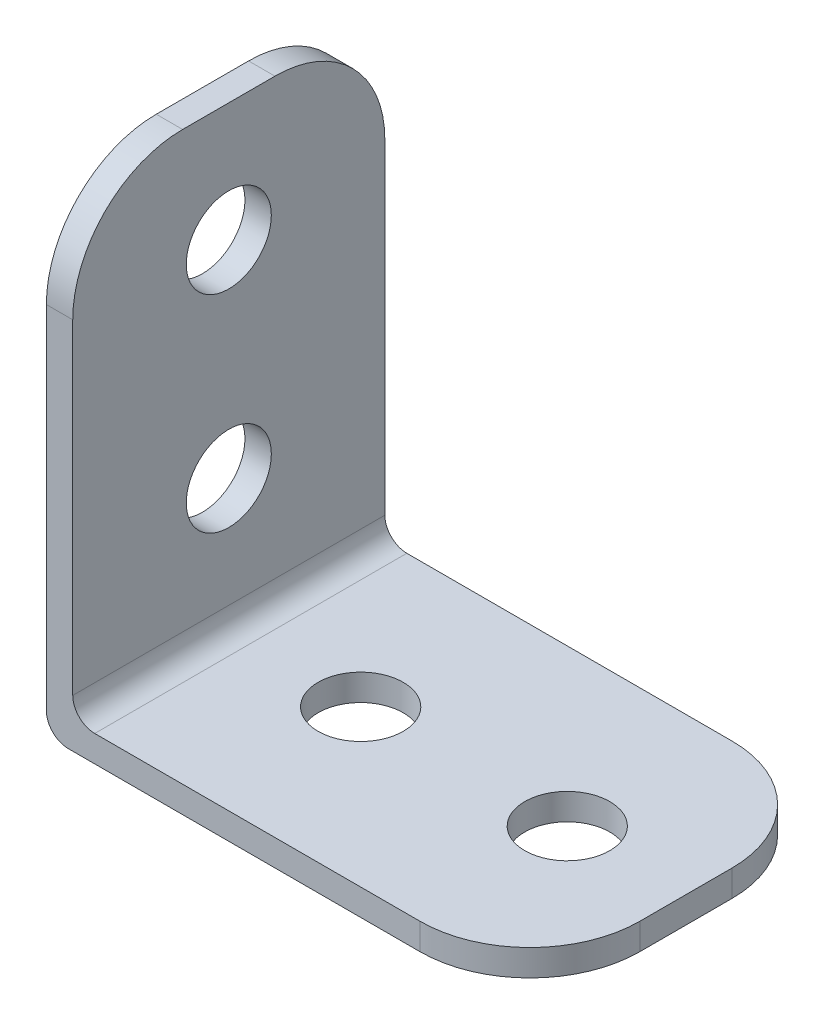
ISO-10303-21;
HEADER;
FILE_DESCRIPTION(('STEP AP214'),'2;1');
FILE_NAME('part.step','',(''),(''),'','','');
FILE_SCHEMA(('AUTOMOTIVE_DESIGN { 1 0 10303 214 1 1 1 1 }'));
ENDSEC;
DATA;
#1=APPLICATION_CONTEXT('core data for automotive mechanical design processes');
#2=APPLICATION_PROTOCOL_DEFINITION('international standard','automotive_design',2000,#1);
#3=PRODUCT_CONTEXT('',#1,'mechanical');
#4=PRODUCT('Part','Part','',(#3));
#5=PRODUCT_RELATED_PRODUCT_CATEGORY('part','',(#4));
#6=PRODUCT_DEFINITION_FORMATION('','',#4);
#7=PRODUCT_DEFINITION_CONTEXT('part definition',#1,'design');
#8=PRODUCT_DEFINITION('design','',#6,#7);
#9=PRODUCT_DEFINITION_SHAPE('','',#8);
#10=(LENGTH_UNIT() NAMED_UNIT(*) SI_UNIT(.MILLI.,.METRE.));
#11=(NAMED_UNIT(*) PLANE_ANGLE_UNIT() SI_UNIT($,.RADIAN.));
#12=(NAMED_UNIT(*) SI_UNIT($,.STERADIAN.) SOLID_ANGLE_UNIT());
#13=UNCERTAINTY_MEASURE_WITH_UNIT(LENGTH_MEASURE(1.E-05),#10,'distance_accuracy_value','');
#14=(GEOMETRIC_REPRESENTATION_CONTEXT(3) GLOBAL_UNCERTAINTY_ASSIGNED_CONTEXT((#13)) GLOBAL_UNIT_ASSIGNED_CONTEXT((#10,
#11,#12)) REPRESENTATION_CONTEXT('',''));
#15=CARTESIAN_POINT('',(0.,0.,0.));
#16=DIRECTION('',(0.,0.,1.));
#17=DIRECTION('',(1.,0.,0.));
#18=AXIS2_PLACEMENT_3D('',#15,#16,#17);
#19=CARTESIAN_POINT('',(14.943252817659,1.524,0.));
#20=DIRECTION('',(1.,0.,0.));
#21=DIRECTION('',(0.,0.,-1.));
#22=AXIS2_PLACEMENT_3D('',#19,#20,#21);
#23=PLANE('',#22);
#24=DIRECTION('',(0.,0.,1.));
#25=VECTOR('',#24,1.);
#26=CARTESIAN_POINT('',(14.943252817659,0.,0.));
#27=LINE('',#26,#25);
#28=CARTESIAN_POINT('',(14.943252817659,0.,-2.77220800376886));
#29=VERTEX_POINT('',#28);
#30=CARTESIAN_POINT('',(14.943252817659,0.,2.56179199623114));
#31=VERTEX_POINT('',#30);
#32=EDGE_CURVE('E270',#29,#31,#27,.T.);
#33=ORIENTED_EDGE('',*,*,#32,.F.);
#34=DIRECTION('',(0.,-1.,0.));
#35=VECTOR('',#34,1.);
#36=CARTESIAN_POINT('',(14.943252817659,1.524,-2.77220800376886));
#37=LINE('',#36,#35);
#38=CARTESIAN_POINT('',(14.943252817659,1.524,-2.77220800376886));
#39=VERTEX_POINT('',#38);
#40=EDGE_CURVE('E67',#29,#39,#37,.F.);
#41=ORIENTED_EDGE('',*,*,#40,.T.);
#42=DIRECTION('',(0.,0.,1.));
#43=VECTOR('',#42,1.);
#44=CARTESIAN_POINT('',(14.943252817659,1.524,0.));
#45=LINE('',#44,#43);
#46=CARTESIAN_POINT('',(14.943252817659,1.524,2.56179199623114));
#47=VERTEX_POINT('',#46);
#48=EDGE_CURVE('E160',#39,#47,#45,.T.);
#49=ORIENTED_EDGE('',*,*,#48,.T.);
#50=DIRECTION('',(0.,-1.,0.));
#51=VECTOR('',#50,1.);
#52=CARTESIAN_POINT('',(14.943252817659,0.,2.56179199623114));
#53=LINE('',#52,#51);
#54=EDGE_CURVE('E227',#47,#31,#53,.T.);
#55=ORIENTED_EDGE('',*,*,#54,.T.);
#56=EDGE_LOOP('',(#33,#41,#49,#55));
#57=FACE_BOUND('',#56,.T.);
#58=ADVANCED_FACE('F43',(#57),#23,.T.);
#59=CARTESIAN_POINT('',(0.,1.524,-9.12220800376886));
#60=DIRECTION('',(0.,0.,-1.));
#61=DIRECTION('',(-1.,0.,0.));
#62=AXIS2_PLACEMENT_3D('',#59,#60,#61);
#63=PLANE('',#62);
#64=DIRECTION('',(0.,-1.,0.));
#65=VECTOR('',#64,1.);
#66=CARTESIAN_POINT('',(-12.996747182341,27.94,-9.12220800376886));
#67=LINE('',#66,#65);
#68=CARTESIAN_POINT('',(-12.996747182341,21.59,-9.12220800376886));
#69=VERTEX_POINT('',#68);
#70=CARTESIAN_POINT('',(-12.996747182341,1.27,-9.12220800376886));
#71=VERTEX_POINT('',#70);
#72=EDGE_CURVE('E259',#69,#71,#67,.T.);
#73=ORIENTED_EDGE('',*,*,#72,.F.);
#74=DIRECTION('',(1.,0.,0.));
#75=VECTOR('',#74,1.);
#76=CARTESIAN_POINT('',(0.,21.59,-9.12220800376886));
#77=LINE('',#76,#75);
#78=CARTESIAN_POINT('',(-11.4727471823411,21.59,-9.12220800376886));
#79=VERTEX_POINT('',#78);
#80=EDGE_CURVE('E218',#69,#79,#77,.T.);
#81=ORIENTED_EDGE('',*,*,#80,.T.);
#82=DIRECTION('',(0.,-1.,0.));
#83=VECTOR('',#82,1.);
#84=CARTESIAN_POINT('',(-11.4727471823411,27.94,-9.12220800376886));
#85=LINE('',#84,#83);
#86=CARTESIAN_POINT('',(-11.4727471823411,2.794,-9.12220800376886));
#87=VERTEX_POINT('',#86);
#88=EDGE_CURVE('E144',#79,#87,#85,.T.);
#89=ORIENTED_EDGE('',*,*,#88,.T.);
#90=CARTESIAN_POINT('',(-10.202747182341,2.794,-9.12220800376886));
#91=DIRECTION('',(0.,0.,-1.));
#92=DIRECTION('',(-1.,0.,0.));
#93=AXIS2_PLACEMENT_3D('',#90,#91,#92);
#94=CIRCLE('',#93,1.27);
#95=CARTESIAN_POINT('',(-10.202747182341,1.524,-9.12220800376886));
#96=VERTEX_POINT('',#95);
#97=EDGE_CURVE('E135',#87,#96,#94,.F.);
#98=ORIENTED_EDGE('',*,*,#97,.T.);
#99=DIRECTION('',(1.,0.,0.));
#100=VECTOR('',#99,1.);
#101=CARTESIAN_POINT('',(0.,1.524,-9.12220800376886));
#102=LINE('',#101,#100);
#103=CARTESIAN_POINT('',(8.59325281765895,1.524,-9.12220800376886));
#104=VERTEX_POINT('',#103);
#105=EDGE_CURVE('E140',#96,#104,#102,.T.);
#106=ORIENTED_EDGE('',*,*,#105,.T.);
#107=DIRECTION('',(0.,-1.,0.));
#108=VECTOR('',#107,1.);
#109=CARTESIAN_POINT('',(8.59325281765895,1.524,-9.12220800376886));
#110=LINE('',#109,#108);
#111=CARTESIAN_POINT('',(8.59325281765895,0.,-9.12220800376886));
#112=VERTEX_POINT('',#111);
#113=EDGE_CURVE('E215',#104,#112,#110,.T.);
#114=ORIENTED_EDGE('',*,*,#113,.T.);
#115=DIRECTION('',(1.,0.,0.));
#116=VECTOR('',#115,1.);
#117=CARTESIAN_POINT('',(0.,0.,-9.12220800376886));
#118=LINE('',#117,#116);
#119=CARTESIAN_POINT('',(-11.7267471823411,0.,-9.12220800376886));
#120=VERTEX_POINT('',#119);
#121=EDGE_CURVE('E275',#120,#112,#118,.T.);
#122=ORIENTED_EDGE('',*,*,#121,.F.);
#123=CARTESIAN_POINT('',(-11.7267471823411,1.27,-9.12220800376886));
#124=DIRECTION('',(0.,0.,-1.));
#125=DIRECTION('',(-1.,0.,0.));
#126=AXIS2_PLACEMENT_3D('',#123,#124,#125);
#127=CIRCLE('',#126,1.27);
#128=EDGE_CURVE('E185',#120,#71,#127,.T.);
#129=ORIENTED_EDGE('',*,*,#128,.T.);
#130=EDGE_LOOP('',(#73,#81,#89,#98,#106,#114,#122,#129));
#131=FACE_BOUND('',#130,.T.);
#132=ADVANCED_FACE('F138',(#131),#63,.T.);
#133=CARTESIAN_POINT('',(0.,1.524,8.91179199623114));
#134=DIRECTION('',(0.,0.,-1.));
#135=DIRECTION('',(-1.,0.,0.));
#136=AXIS2_PLACEMENT_3D('',#133,#134,#135);
#137=PLANE('',#136);
#138=DIRECTION('',(0.,-1.,0.));
#139=VECTOR('',#138,1.);
#140=CARTESIAN_POINT('',(-11.472747182341,27.94,8.91179199623114));
#141=LINE('',#140,#139);
#142=CARTESIAN_POINT('',(-11.472747182341,21.59,8.91179199623114));
#143=VERTEX_POINT('',#142);
#144=CARTESIAN_POINT('',(-11.472747182341,2.794,8.91179199623114));
#145=VERTEX_POINT('',#144);
#146=EDGE_CURVE('E264',#143,#145,#141,.T.);
#147=ORIENTED_EDGE('',*,*,#146,.F.);
#148=DIRECTION('',(1.,0.,0.));
#149=VECTOR('',#148,1.);
#150=CARTESIAN_POINT('',(-12.996747182341,21.59,8.91179199623114));
#151=LINE('',#150,#149);
#152=CARTESIAN_POINT('',(-12.996747182341,21.59,8.91179199623114));
#153=VERTEX_POINT('',#152);
#154=EDGE_CURVE('E206',#143,#153,#151,.F.);
#155=ORIENTED_EDGE('',*,*,#154,.T.);
#156=DIRECTION('',(0.,-1.,0.));
#157=VECTOR('',#156,1.);
#158=CARTESIAN_POINT('',(-12.996747182341,27.94,8.91179199623114));
#159=LINE('',#158,#157);
#160=CARTESIAN_POINT('',(-12.996747182341,1.27,8.91179199623114));
#161=VERTEX_POINT('',#160);
#162=EDGE_CURVE('E267',#153,#161,#159,.T.);
#163=ORIENTED_EDGE('',*,*,#162,.T.);
#164=CARTESIAN_POINT('',(-11.7267471823411,1.27,8.91179199623114));
#165=DIRECTION('',(0.,0.,-1.));
#166=DIRECTION('',(-1.,0.,0.));
#167=AXIS2_PLACEMENT_3D('',#164,#165,#166);
#168=CIRCLE('',#167,1.27);
#169=CARTESIAN_POINT('',(-11.7267471823411,0.,8.91179199623114));
#170=VERTEX_POINT('',#169);
#171=EDGE_CURVE('E179',#161,#170,#168,.F.);
#172=ORIENTED_EDGE('',*,*,#171,.T.);
#173=DIRECTION('',(1.,0.,0.));
#174=VECTOR('',#173,1.);
#175=CARTESIAN_POINT('',(0.,0.,8.91179199623114));
#176=LINE('',#175,#174);
#177=CARTESIAN_POINT('',(8.59325281765895,0.,8.91179199623114));
#178=VERTEX_POINT('',#177);
#179=EDGE_CURVE('E173',#170,#178,#176,.T.);
#180=ORIENTED_EDGE('',*,*,#179,.T.);
#181=DIRECTION('',(0.,-1.,0.));
#182=VECTOR('',#181,1.);
#183=CARTESIAN_POINT('',(8.59325281765895,1.524,8.91179199623114));
#184=LINE('',#183,#182);
#185=CARTESIAN_POINT('',(8.59325281765895,1.524,8.91179199623114));
#186=VERTEX_POINT('',#185);
#187=EDGE_CURVE('E203',#178,#186,#184,.F.);
#188=ORIENTED_EDGE('',*,*,#187,.T.);
#189=DIRECTION('',(1.,0.,0.));
#190=VECTOR('',#189,1.);
#191=CARTESIAN_POINT('',(0.,1.524,8.91179199623114));
#192=LINE('',#191,#190);
#193=CARTESIAN_POINT('',(-10.202747182341,1.524,8.91179199623114));
#194=VERTEX_POINT('',#193);
#195=EDGE_CURVE('E159',#194,#186,#192,.T.);
#196=ORIENTED_EDGE('',*,*,#195,.F.);
#197=CARTESIAN_POINT('',(-10.202747182341,2.794,8.91179199623114));
#198=DIRECTION('',(0.,0.,-1.));
#199=DIRECTION('',(-1.,0.,0.));
#200=AXIS2_PLACEMENT_3D('',#197,#198,#199);
#201=CIRCLE('',#200,1.27);
#202=EDGE_CURVE('E151',#194,#145,#201,.T.);
#203=ORIENTED_EDGE('',*,*,#202,.T.);
#204=EDGE_LOOP('',(#147,#155,#163,#172,#180,#188,#196,#203));
#205=FACE_BOUND('',#204,.T.);
#206=ADVANCED_FACE('F286',(#205),#137,.F.);
#207=CARTESIAN_POINT('',(0.,1.524,0.));
#208=DIRECTION('',(0.,1.,0.));
#209=DIRECTION('',(0.,0.,1.));
#210=AXIS2_PLACEMENT_3D('',#207,#208,#209);
#211=PLANE('',#210);
#212=CARTESIAN_POINT('',(-3.85274718234105,1.524,-0.105208003768859));
#213=DIRECTION('',(0.,1.,0.));
#214=DIRECTION('',(0.,0.,1.));
#215=AXIS2_PLACEMENT_3D('',#212,#213,#214);
#216=CIRCLE('',#215,2.45745);
#217=CARTESIAN_POINT('',(-3.85274718234105,1.524,2.35224199623114));
#218=VERTEX_POINT('',#217);
#219=EDGE_CURVE('E252',#218,#218,#216,.T.);
#220=ORIENTED_EDGE('',*,*,#219,.F.);
#221=EDGE_LOOP('',(#220));
#222=FACE_BOUND('',#221,.T.);
#223=CARTESIAN_POINT('',(8.08525281765895,1.524,-0.105208003768859));
#224=DIRECTION('',(0.,1.,0.));
#225=DIRECTION('',(0.,0.,1.));
#226=AXIS2_PLACEMENT_3D('',#223,#224,#225);
#227=CIRCLE('',#226,2.45745);
#228=CARTESIAN_POINT('',(8.08525281765895,1.524,2.35224199623114));
#229=VERTEX_POINT('',#228);
#230=EDGE_CURVE('E238',#229,#229,#227,.T.);
#231=ORIENTED_EDGE('',*,*,#230,.F.);
#232=EDGE_LOOP('',(#231));
#233=FACE_BOUND('',#232,.T.);
#234=ORIENTED_EDGE('',*,*,#48,.F.);
#235=CARTESIAN_POINT('',(8.59325281765895,1.524,-2.77220800376886));
#236=DIRECTION('',(0.,1.,0.));
#237=DIRECTION('',(0.,0.,1.));
#238=AXIS2_PLACEMENT_3D('',#235,#236,#237);
#239=CIRCLE('',#238,6.35);
#240=EDGE_CURVE('E11',#39,#104,#239,.T.);
#241=ORIENTED_EDGE('',*,*,#240,.T.);
#242=ORIENTED_EDGE('',*,*,#105,.F.);
#243=DIRECTION('',(0.,0.,1.));
#244=VECTOR('',#243,1.);
#245=CARTESIAN_POINT('',(-10.202747182341,1.524,8.91179199623114));
#246=LINE('',#245,#244);
#247=EDGE_CURVE('E155',#96,#194,#246,.T.);
#248=ORIENTED_EDGE('',*,*,#247,.T.);
#249=ORIENTED_EDGE('',*,*,#195,.T.);
#250=CARTESIAN_POINT('',(8.59325281765895,1.524,2.56179199623114));
#251=DIRECTION('',(0.,1.,0.));
#252=DIRECTION('',(0.,0.,1.));
#253=AXIS2_PLACEMENT_3D('',#250,#251,#252);
#254=CIRCLE('',#253,6.35);
#255=EDGE_CURVE('E53',#186,#47,#254,.T.);
#256=ORIENTED_EDGE('',*,*,#255,.T.);
#257=EDGE_LOOP('',(#234,#241,#242,#248,#249,#256));
#258=FACE_BOUND('',#257,.T.);
#259=ADVANCED_FACE('F154',(#222,#233,#258),#211,.T.);
#260=CARTESIAN_POINT('',(0.,0.,0.));
#261=DIRECTION('',(0.,1.,0.));
#262=DIRECTION('',(0.,0.,1.));
#263=AXIS2_PLACEMENT_3D('',#260,#261,#262);
#264=PLANE('',#263);
#265=CARTESIAN_POINT('',(-3.85274718234105,0.,-0.105208003768859));
#266=DIRECTION('',(0.,1.,0.));
#267=DIRECTION('',(0.,0.,1.));
#268=AXIS2_PLACEMENT_3D('',#265,#266,#267);
#269=CIRCLE('',#268,2.45745);
#270=CARTESIAN_POINT('',(-3.85274718234105,0.,2.35224199623114));
#271=VERTEX_POINT('',#270);
#272=EDGE_CURVE('E47',#271,#271,#269,.T.);
#273=ORIENTED_EDGE('',*,*,#272,.T.);
#274=EDGE_LOOP('',(#273));
#275=FACE_BOUND('',#274,.T.);
#276=CARTESIAN_POINT('',(8.08525281765895,0.,-0.105208003768859));
#277=DIRECTION('',(0.,1.,0.));
#278=DIRECTION('',(0.,0.,1.));
#279=AXIS2_PLACEMENT_3D('',#276,#277,#278);
#280=CIRCLE('',#279,2.45745);
#281=CARTESIAN_POINT('',(8.08525281765895,0.,2.35224199623114));
#282=VERTEX_POINT('',#281);
#283=EDGE_CURVE('E234',#282,#282,#280,.T.);
#284=ORIENTED_EDGE('',*,*,#283,.T.);
#285=EDGE_LOOP('',(#284));
#286=FACE_BOUND('',#285,.T.);
#287=ORIENTED_EDGE('',*,*,#121,.T.);
#288=CARTESIAN_POINT('',(8.59325281765895,0.,-2.77220800376886));
#289=DIRECTION('',(0.,1.,0.));
#290=DIRECTION('',(0.,0.,1.));
#291=AXIS2_PLACEMENT_3D('',#288,#289,#290);
#292=CIRCLE('',#291,6.35);
#293=EDGE_CURVE('E224',#112,#29,#292,.F.);
#294=ORIENTED_EDGE('',*,*,#293,.T.);
#295=ORIENTED_EDGE('',*,*,#32,.T.);
#296=CARTESIAN_POINT('',(8.59325281765895,0.,2.56179199623114));
#297=DIRECTION('',(0.,1.,0.));
#298=DIRECTION('',(0.,0.,1.));
#299=AXIS2_PLACEMENT_3D('',#296,#297,#298);
#300=CIRCLE('',#299,6.35);
#301=EDGE_CURVE('E221',#31,#178,#300,.F.);
#302=ORIENTED_EDGE('',*,*,#301,.T.);
#303=ORIENTED_EDGE('',*,*,#179,.F.);
#304=DIRECTION('',(0.,0.,1.));
#305=VECTOR('',#304,1.);
#306=CARTESIAN_POINT('',(-11.7267471823411,0.,0.));
#307=LINE('',#306,#305);
#308=EDGE_CURVE('E182',#170,#120,#307,.F.);
#309=ORIENTED_EDGE('',*,*,#308,.T.);
#310=EDGE_LOOP('',(#287,#294,#295,#302,#303,#309));
#311=FACE_BOUND('',#310,.T.);
#312=ADVANCED_FACE('F291',(#275,#286,#311),#264,.F.);
#313=CARTESIAN_POINT('',(-11.472747182341,27.94,0.));
#314=DIRECTION('',(1.,0.,0.));
#315=DIRECTION('',(0.,0.,-1.));
#316=AXIS2_PLACEMENT_3D('',#313,#314,#315);
#317=PLANE('',#316);
#318=CARTESIAN_POINT('',(-11.472747182341,9.144,-0.105208003768858));
#319=DIRECTION('',(1.,0.,0.));
#320=DIRECTION('',(0.,0.,-1.));
#321=AXIS2_PLACEMENT_3D('',#318,#319,#320);
#322=CIRCLE('',#321,2.45744999999999);
#323=CARTESIAN_POINT('',(-11.472747182341,9.144,-2.56265800376885));
#324=VERTEX_POINT('',#323);
#325=EDGE_CURVE('E431',#324,#324,#322,.T.);
#326=ORIENTED_EDGE('',*,*,#325,.F.);
#327=EDGE_LOOP('',(#326));
#328=FACE_BOUND('',#327,.T.);
#329=CARTESIAN_POINT('',(-11.472747182341,21.082,-0.105208003768858));
#330=DIRECTION('',(1.,0.,0.));
#331=DIRECTION('',(0.,0.,-1.));
#332=AXIS2_PLACEMENT_3D('',#329,#330,#331);
#333=CIRCLE('',#332,2.45744999999999);
#334=CARTESIAN_POINT('',(-11.472747182341,21.082,-2.56265800376885));
#335=VERTEX_POINT('',#334);
#336=EDGE_CURVE('E420',#335,#335,#333,.T.);
#337=ORIENTED_EDGE('',*,*,#336,.F.);
#338=EDGE_LOOP('',(#337));
#339=FACE_BOUND('',#338,.T.);
#340=DIRECTION('',(0.,0.,1.));
#341=VECTOR('',#340,1.);
#342=CARTESIAN_POINT('',(-11.472747182341,27.94,0.));
#343=LINE('',#342,#341);
#344=CARTESIAN_POINT('',(-11.472747182341,27.94,-2.77220800376886));
#345=VERTEX_POINT('',#344);
#346=CARTESIAN_POINT('',(-11.472747182341,27.94,2.56179199623114));
#347=VERTEX_POINT('',#346);
#348=EDGE_CURVE('E244',#345,#347,#343,.T.);
#349=ORIENTED_EDGE('',*,*,#348,.T.);
#350=CARTESIAN_POINT('',(-11.472747182341,21.59,2.56179199623114));
#351=DIRECTION('',(1.,0.,0.));
#352=DIRECTION('',(0.,0.,-1.));
#353=AXIS2_PLACEMENT_3D('',#350,#351,#352);
#354=CIRCLE('',#353,6.35);
#355=EDGE_CURVE('E200',#347,#143,#354,.T.);
#356=ORIENTED_EDGE('',*,*,#355,.T.);
#357=ORIENTED_EDGE('',*,*,#146,.T.);
#358=DIRECTION('',(0.,0.,1.));
#359=VECTOR('',#358,1.);
#360=CARTESIAN_POINT('',(-11.4727471823411,2.794,-9.12220800376886));
#361=LINE('',#360,#359);
#362=EDGE_CURVE('E165',#145,#87,#361,.F.);
#363=ORIENTED_EDGE('',*,*,#362,.T.);
#364=ORIENTED_EDGE('',*,*,#88,.F.);
#365=CARTESIAN_POINT('',(-11.472747182341,21.59,-2.77220800376886));
#366=DIRECTION('',(1.,0.,0.));
#367=DIRECTION('',(0.,0.,-1.));
#368=AXIS2_PLACEMENT_3D('',#365,#366,#367);
#369=CIRCLE('',#368,6.35);
#370=EDGE_CURVE('E197',#79,#345,#369,.T.);
#371=ORIENTED_EDGE('',*,*,#370,.T.);
#372=EDGE_LOOP('',(#349,#356,#357,#363,#364,#371));
#373=FACE_BOUND('',#372,.T.);
#374=ADVANCED_FACE('F310',(#328,#339,#373),#317,.T.);
#375=CARTESIAN_POINT('',(-12.996747182341,27.94,0.));
#376=DIRECTION('',(1.,0.,0.));
#377=DIRECTION('',(0.,0.,-1.));
#378=AXIS2_PLACEMENT_3D('',#375,#376,#377);
#379=PLANE('',#378);
#380=CARTESIAN_POINT('',(-12.996747182341,9.144,-0.105208003768858));
#381=DIRECTION('',(1.,0.,0.));
#382=DIRECTION('',(0.,0.,-1.));
#383=AXIS2_PLACEMENT_3D('',#380,#381,#382);
#384=CIRCLE('',#383,2.45744999999999);
#385=CARTESIAN_POINT('',(-12.996747182341,9.144,-2.56265800376885));
#386=VERTEX_POINT('',#385);
#387=EDGE_CURVE('E425',#386,#386,#384,.T.);
#388=ORIENTED_EDGE('',*,*,#387,.T.);
#389=EDGE_LOOP('',(#388));
#390=FACE_BOUND('',#389,.T.);
#391=CARTESIAN_POINT('',(-12.996747182341,21.082,-0.105208003768858));
#392=DIRECTION('',(1.,0.,0.));
#393=DIRECTION('',(0.,0.,-1.));
#394=AXIS2_PLACEMENT_3D('',#391,#392,#393);
#395=CIRCLE('',#394,2.45744999999999);
#396=CARTESIAN_POINT('',(-12.996747182341,21.082,-2.56265800376885));
#397=VERTEX_POINT('',#396);
#398=EDGE_CURVE('E417',#397,#397,#395,.T.);
#399=ORIENTED_EDGE('',*,*,#398,.T.);
#400=EDGE_LOOP('',(#399));
#401=FACE_BOUND('',#400,.T.);
#402=ORIENTED_EDGE('',*,*,#162,.F.);
#403=CARTESIAN_POINT('',(-12.996747182341,21.59,2.56179199623114));
#404=DIRECTION('',(1.,0.,0.));
#405=DIRECTION('',(0.,0.,-1.));
#406=AXIS2_PLACEMENT_3D('',#403,#404,#405);
#407=CIRCLE('',#406,6.35);
#408=CARTESIAN_POINT('',(-12.996747182341,27.94,2.56179199623114));
#409=VERTEX_POINT('',#408);
#410=EDGE_CURVE('E212',#153,#409,#407,.F.);
#411=ORIENTED_EDGE('',*,*,#410,.T.);
#412=DIRECTION('',(0.,0.,1.));
#413=VECTOR('',#412,1.);
#414=CARTESIAN_POINT('',(-12.996747182341,27.94,0.));
#415=LINE('',#414,#413);
#416=CARTESIAN_POINT('',(-12.996747182341,27.94,-2.77220800376886));
#417=VERTEX_POINT('',#416);
#418=EDGE_CURVE('E237',#417,#409,#415,.T.);
#419=ORIENTED_EDGE('',*,*,#418,.F.);
#420=CARTESIAN_POINT('',(-12.996747182341,21.59,-2.77220800376886));
#421=DIRECTION('',(1.,0.,0.));
#422=DIRECTION('',(0.,0.,-1.));
#423=AXIS2_PLACEMENT_3D('',#420,#421,#422);
#424=CIRCLE('',#423,6.35);
#425=EDGE_CURVE('E209',#417,#69,#424,.F.);
#426=ORIENTED_EDGE('',*,*,#425,.T.);
#427=ORIENTED_EDGE('',*,*,#72,.T.);
#428=DIRECTION('',(0.,0.,1.));
#429=VECTOR('',#428,1.);
#430=CARTESIAN_POINT('',(-12.996747182341,1.27,0.));
#431=LINE('',#430,#429);
#432=EDGE_CURVE('E169',#71,#161,#431,.T.);
#433=ORIENTED_EDGE('',*,*,#432,.T.);
#434=EDGE_LOOP('',(#402,#411,#419,#426,#427,#433));
#435=FACE_BOUND('',#434,.T.);
#436=ADVANCED_FACE('F300',(#390,#401,#435),#379,.F.);
#437=CARTESIAN_POINT('',(0.,27.94,0.));
#438=DIRECTION('',(0.,1.,0.));
#439=DIRECTION('',(0.,0.,1.));
#440=AXIS2_PLACEMENT_3D('',#437,#438,#439);
#441=PLANE('',#440);
#442=ORIENTED_EDGE('',*,*,#418,.T.);
#443=DIRECTION('',(1.,0.,0.));
#444=VECTOR('',#443,1.);
#445=CARTESIAN_POINT('',(-11.472747182341,27.94,2.56179199623114));
#446=LINE('',#445,#444);
#447=EDGE_CURVE('E193',#409,#347,#446,.T.);
#448=ORIENTED_EDGE('',*,*,#447,.T.);
#449=ORIENTED_EDGE('',*,*,#348,.F.);
#450=DIRECTION('',(1.,0.,0.));
#451=VECTOR('',#450,1.);
#452=CARTESIAN_POINT('',(0.,27.94,-2.77220800376886));
#453=LINE('',#452,#451);
#454=EDGE_CURVE('E150',#345,#417,#453,.F.);
#455=ORIENTED_EDGE('',*,*,#454,.T.);
#456=EDGE_LOOP('',(#442,#448,#449,#455));
#457=FACE_BOUND('',#456,.T.);
#458=ADVANCED_FACE('F312',(#457),#441,.T.);
#459=CARTESIAN_POINT('',(-10.202747182341,2.794,0.));
#460=DIRECTION('',(0.,0.,-1.));
#461=DIRECTION('',(-1.,0.,0.));
#462=AXIS2_PLACEMENT_3D('',#459,#460,#461);
#463=CYLINDRICAL_SURFACE('',#462,1.27);
#464=ORIENTED_EDGE('',*,*,#97,.F.);
#465=ORIENTED_EDGE('',*,*,#362,.F.);
#466=ORIENTED_EDGE('',*,*,#202,.F.);
#467=ORIENTED_EDGE('',*,*,#247,.F.);
#468=EDGE_LOOP('',(#464,#465,#466,#467));
#469=FACE_BOUND('',#468,.T.);
#470=ADVANCED_FACE('F162',(#469),#463,.F.);
#471=CARTESIAN_POINT('',(-11.7267471823411,1.27,0.));
#472=DIRECTION('',(0.,0.,1.));
#473=DIRECTION('',(1.,0.,0.));
#474=AXIS2_PLACEMENT_3D('',#471,#472,#473);
#475=CYLINDRICAL_SURFACE('',#474,1.27);
#476=ORIENTED_EDGE('',*,*,#128,.F.);
#477=ORIENTED_EDGE('',*,*,#308,.F.);
#478=ORIENTED_EDGE('',*,*,#171,.F.);
#479=ORIENTED_EDGE('',*,*,#432,.F.);
#480=EDGE_LOOP('',(#476,#477,#478,#479));
#481=FACE_BOUND('',#480,.T.);
#482=ADVANCED_FACE('F297',(#481),#475,.T.);
#483=CARTESIAN_POINT('',(0.,21.59,2.56179199623114));
#484=DIRECTION('',(-1.,0.,0.));
#485=DIRECTION('',(0.,0.,1.));
#486=AXIS2_PLACEMENT_3D('',#483,#484,#485);
#487=CYLINDRICAL_SURFACE('',#486,6.35);
#488=ORIENTED_EDGE('',*,*,#410,.F.);
#489=ORIENTED_EDGE('',*,*,#154,.F.);
#490=ORIENTED_EDGE('',*,*,#355,.F.);
#491=ORIENTED_EDGE('',*,*,#447,.F.);
#492=EDGE_LOOP('',(#488,#489,#490,#491));
#493=FACE_BOUND('',#492,.T.);
#494=ADVANCED_FACE('F315',(#493),#487,.T.);
#495=CARTESIAN_POINT('',(0.,21.59,-2.77220800376886));
#496=DIRECTION('',(1.,0.,0.));
#497=DIRECTION('',(0.,0.,-1.));
#498=AXIS2_PLACEMENT_3D('',#495,#496,#497);
#499=CYLINDRICAL_SURFACE('',#498,6.35);
#500=ORIENTED_EDGE('',*,*,#425,.F.);
#501=ORIENTED_EDGE('',*,*,#454,.F.);
#502=ORIENTED_EDGE('',*,*,#370,.F.);
#503=ORIENTED_EDGE('',*,*,#80,.F.);
#504=EDGE_LOOP('',(#500,#501,#502,#503));
#505=FACE_BOUND('',#504,.T.);
#506=ADVANCED_FACE('F306',(#505),#499,.T.);
#507=CARTESIAN_POINT('',(8.59325281765895,1.524,-2.77220800376886));
#508=DIRECTION('',(0.,-1.,0.));
#509=DIRECTION('',(0.,0.,-1.));
#510=AXIS2_PLACEMENT_3D('',#507,#508,#509);
#511=CYLINDRICAL_SURFACE('',#510,6.35);
#512=ORIENTED_EDGE('',*,*,#240,.F.);
#513=ORIENTED_EDGE('',*,*,#40,.F.);
#514=ORIENTED_EDGE('',*,*,#293,.F.);
#515=ORIENTED_EDGE('',*,*,#113,.F.);
#516=EDGE_LOOP('',(#512,#513,#514,#515));
#517=FACE_BOUND('',#516,.T.);
#518=ADVANCED_FACE('F293',(#517),#511,.T.);
#519=CARTESIAN_POINT('',(8.59325281765895,1.524,2.56179199623114));
#520=DIRECTION('',(0.,1.,0.));
#521=DIRECTION('',(0.,0.,1.));
#522=AXIS2_PLACEMENT_3D('',#519,#520,#521);
#523=CYLINDRICAL_SURFACE('',#522,6.35);
#524=ORIENTED_EDGE('',*,*,#255,.F.);
#525=ORIENTED_EDGE('',*,*,#187,.F.);
#526=ORIENTED_EDGE('',*,*,#301,.F.);
#527=ORIENTED_EDGE('',*,*,#54,.F.);
#528=EDGE_LOOP('',(#524,#525,#526,#527));
#529=FACE_BOUND('',#528,.T.);
#530=ADVANCED_FACE('F45',(#529),#523,.T.);
#531=CARTESIAN_POINT('',(8.08525281765895,1.524,-0.105208003768859));
#532=DIRECTION('',(0.,1.,0.));
#533=DIRECTION('',(0.,0.,1.));
#534=AXIS2_PLACEMENT_3D('',#531,#532,#533);
#535=CYLINDRICAL_SURFACE('',#534,2.45745);
#536=ORIENTED_EDGE('',*,*,#230,.T.);
#537=EDGE_LOOP('',(#536));
#538=FACE_BOUND('',#537,.T.);
#539=ORIENTED_EDGE('',*,*,#283,.F.);
#540=EDGE_LOOP('',(#539));
#541=FACE_BOUND('',#540,.T.);
#542=ADVANCED_FACE('F345',(#538,#541),#535,.F.);
#543=CARTESIAN_POINT('',(-3.85274718234105,1.524,-0.105208003768859));
#544=DIRECTION('',(0.,1.,0.));
#545=DIRECTION('',(0.,0.,1.));
#546=AXIS2_PLACEMENT_3D('',#543,#544,#545);
#547=CYLINDRICAL_SURFACE('',#546,2.45745);
#548=ORIENTED_EDGE('',*,*,#219,.T.);
#549=EDGE_LOOP('',(#548));
#550=FACE_BOUND('',#549,.T.);
#551=ORIENTED_EDGE('',*,*,#272,.F.);
#552=EDGE_LOOP('',(#551));
#553=FACE_BOUND('',#552,.T.);
#554=ADVANCED_FACE('F391',(#550,#553),#547,.F.);
#555=CARTESIAN_POINT('',(-11.472747182341,21.082,-0.105208003768858));
#556=DIRECTION('',(1.,0.,0.));
#557=DIRECTION('',(0.,0.,-1.));
#558=AXIS2_PLACEMENT_3D('',#555,#556,#557);
#559=CYLINDRICAL_SURFACE('',#558,2.45744999999999);
#560=ORIENTED_EDGE('',*,*,#336,.T.);
#561=EDGE_LOOP('',(#560));
#562=FACE_BOUND('',#561,.T.);
#563=ORIENTED_EDGE('',*,*,#398,.F.);
#564=EDGE_LOOP('',(#563));
#565=FACE_BOUND('',#564,.T.);
#566=ADVANCED_FACE('F385',(#562,#565),#559,.F.);
#567=CARTESIAN_POINT('',(-11.472747182341,9.144,-0.105208003768858));
#568=DIRECTION('',(1.,0.,0.));
#569=DIRECTION('',(0.,0.,-1.));
#570=AXIS2_PLACEMENT_3D('',#567,#568,#569);
#571=CYLINDRICAL_SURFACE('',#570,2.45744999999999);
#572=ORIENTED_EDGE('',*,*,#325,.T.);
#573=EDGE_LOOP('',(#572));
#574=FACE_BOUND('',#573,.T.);
#575=ORIENTED_EDGE('',*,*,#387,.F.);
#576=EDGE_LOOP('',(#575));
#577=FACE_BOUND('',#576,.T.);
#578=ADVANCED_FACE('F390',(#574,#577),#571,.F.);
#579=CLOSED_SHELL('',(#58,#132,#206,#259,#312,#374,#436,#458,#470,#482,#494,#506,#518,#530,#542,
#554,#566,#578));
#580=MANIFOLD_SOLID_BREP('B2',#579);
#581=ADVANCED_BREP_SHAPE_REPRESENTATION('',(#18,#580),#14);
#582=SHAPE_DEFINITION_REPRESENTATION(#9,#581);
ENDSEC;
END-ISO-10303-21;
